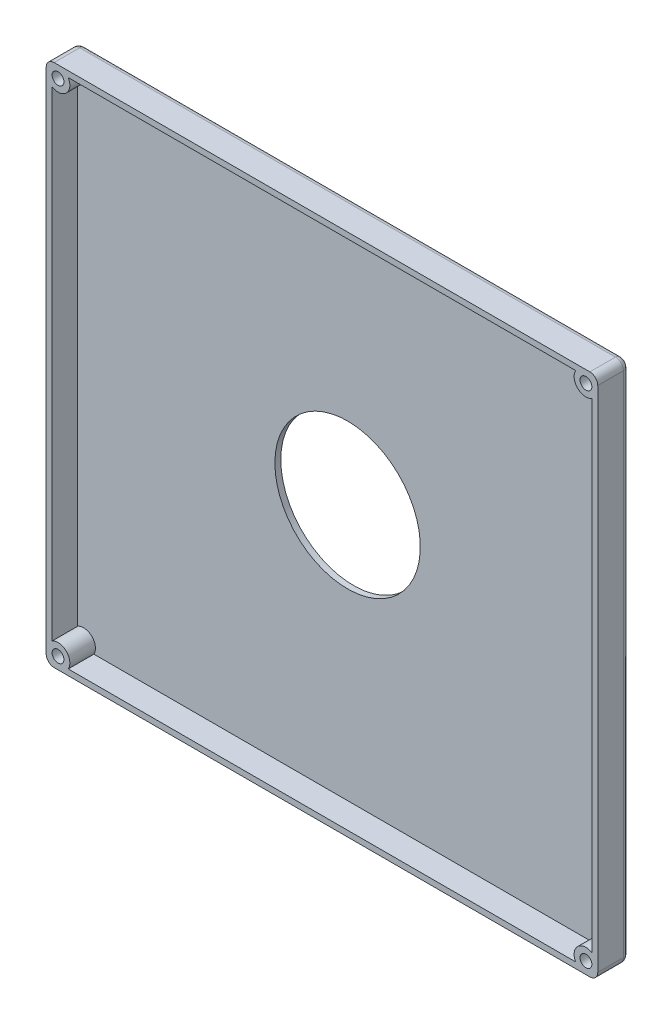
ISO-10303-21;
HEADER;
FILE_DESCRIPTION(('STEP AP214'),'2;1');
FILE_NAME('part.step','',(''),(''),'','','');
FILE_SCHEMA(('AUTOMOTIVE_DESIGN { 1 0 10303 214 1 1 1 1 }'));
ENDSEC;
DATA;
#1=APPLICATION_CONTEXT('core data for automotive mechanical design processes');
#2=APPLICATION_PROTOCOL_DEFINITION('international standard','automotive_design',2000,#1);
#3=PRODUCT_CONTEXT('',#1,'mechanical');
#4=PRODUCT('Part','Part','',(#3));
#5=PRODUCT_RELATED_PRODUCT_CATEGORY('part','',(#4));
#6=PRODUCT_DEFINITION_FORMATION('','',#4);
#7=PRODUCT_DEFINITION_CONTEXT('part definition',#1,'design');
#8=PRODUCT_DEFINITION('design','',#6,#7);
#9=PRODUCT_DEFINITION_SHAPE('','',#8);
#10=(LENGTH_UNIT() NAMED_UNIT(*) SI_UNIT(.MILLI.,.METRE.));
#11=(NAMED_UNIT(*) PLANE_ANGLE_UNIT() SI_UNIT($,.RADIAN.));
#12=(NAMED_UNIT(*) SI_UNIT($,.STERADIAN.) SOLID_ANGLE_UNIT());
#13=UNCERTAINTY_MEASURE_WITH_UNIT(LENGTH_MEASURE(1.E-05),#10,'distance_accuracy_value','');
#14=(GEOMETRIC_REPRESENTATION_CONTEXT(3) GLOBAL_UNCERTAINTY_ASSIGNED_CONTEXT((#13)) GLOBAL_UNIT_ASSIGNED_CONTEXT((#10,
#11,#12)) REPRESENTATION_CONTEXT('',''));
#15=CARTESIAN_POINT('',(0.,0.,0.));
#16=DIRECTION('',(0.,0.,1.));
#17=DIRECTION('',(1.,0.,0.));
#18=AXIS2_PLACEMENT_3D('',#15,#16,#17);
#19=CARTESIAN_POINT('',(68.5,-66.5,1.5));
#20=DIRECTION('',(0.,-1.,0.));
#21=DIRECTION('',(0.,0.,-1.));
#22=AXIS2_PLACEMENT_3D('',#19,#20,#21);
#23=CYLINDRICAL_SURFACE('',#22,1.5);
#24=CARTESIAN_POINT('',(68.5,64.5,1.5));
#25=DIRECTION('',(0.,1.,0.));
#26=DIRECTION('',(0.,0.,1.));
#27=AXIS2_PLACEMENT_3D('',#24,#25,#26);
#28=CIRCLE('',#27,1.5);
#29=CARTESIAN_POINT('',(70.,64.5,1.5));
#30=VERTEX_POINT('',#29);
#31=CARTESIAN_POINT('',(68.5,64.5,0.));
#32=VERTEX_POINT('',#31);
#33=EDGE_CURVE('E11',#30,#32,#28,.T.);
#34=ORIENTED_EDGE('',*,*,#33,.F.);
#35=DIRECTION('',(0.,1.,0.));
#36=VECTOR('',#35,1.);
#37=CARTESIAN_POINT('',(70.,-66.5,1.5));
#38=LINE('',#37,#36);
#39=CARTESIAN_POINT('',(70.,-64.5,1.5));
#40=VERTEX_POINT('',#39);
#41=EDGE_CURVE('E403',#40,#30,#38,.T.);
#42=ORIENTED_EDGE('',*,*,#41,.F.);
#43=CARTESIAN_POINT('',(68.5,-64.5,1.5));
#44=DIRECTION('',(0.,1.,0.));
#45=DIRECTION('',(0.,0.,1.));
#46=AXIS2_PLACEMENT_3D('',#43,#44,#45);
#47=CIRCLE('',#46,1.5);
#48=CARTESIAN_POINT('',(68.5,-64.5,0.));
#49=VERTEX_POINT('',#48);
#50=EDGE_CURVE('E45',#40,#49,#47,.T.);
#51=ORIENTED_EDGE('',*,*,#50,.T.);
#52=DIRECTION('',(0.,1.,0.));
#53=VECTOR('',#52,1.);
#54=CARTESIAN_POINT('',(68.5,-66.5,0.));
#55=LINE('',#54,#53);
#56=CARTESIAN_POINT('',(68.5,-63.5,0.));
#57=VERTEX_POINT('',#56);
#58=EDGE_CURVE('E342',#57,#49,#55,.F.);
#59=ORIENTED_EDGE('',*,*,#58,.F.);
#60=DIRECTION('',(0.,1.,0.));
#61=VECTOR('',#60,1.);
#62=CARTESIAN_POINT('',(68.5,-66.5,0.));
#63=LINE('',#62,#61);
#64=CARTESIAN_POINT('',(68.5,63.5,0.));
#65=VERTEX_POINT('',#64);
#66=EDGE_CURVE('E345',#65,#57,#63,.F.);
#67=ORIENTED_EDGE('',*,*,#66,.F.);
#68=DIRECTION('',(0.,1.,0.));
#69=VECTOR('',#68,1.);
#70=CARTESIAN_POINT('',(68.5,-66.5,0.));
#71=LINE('',#70,#69);
#72=EDGE_CURVE('E347',#32,#65,#71,.F.);
#73=ORIENTED_EDGE('',*,*,#72,.F.);
#74=EDGE_LOOP('',(#34,#42,#51,#59,#67,#73));
#75=FACE_BOUND('',#74,.T.);
#76=ADVANCED_FACE('F38',(#75),#23,.T.);
#77=CARTESIAN_POINT('',(68.,-64.5,1.5));
#78=DIRECTION('',(0.,0.,-1.));
#79=DIRECTION('',(-1.,0.,0.));
#80=AXIS2_PLACEMENT_3D('',#77,#78,#79);
#81=DEGENERATE_TOROIDAL_SURFACE('',#80,0.5,1.5,.T.);
#82=ORIENTED_EDGE('',*,*,#50,.F.);
#83=CARTESIAN_POINT('',(68.,-64.5,1.5));
#84=DIRECTION('',(0.,0.,-1.));
#85=DIRECTION('',(-1.,0.,0.));
#86=AXIS2_PLACEMENT_3D('',#83,#84,#85);
#87=CIRCLE('',#86,2.);
#88=CARTESIAN_POINT('',(68.,-66.5,1.5));
#89=VERTEX_POINT('',#88);
#90=EDGE_CURVE('E400',#89,#40,#87,.F.);
#91=ORIENTED_EDGE('',*,*,#90,.F.);
#92=CARTESIAN_POINT('',(68.,-65.,1.5));
#93=DIRECTION('',(1.,0.,0.));
#94=DIRECTION('',(0.,0.,-1.));
#95=AXIS2_PLACEMENT_3D('',#92,#93,#94);
#96=CIRCLE('',#95,1.5);
#97=CARTESIAN_POINT('',(68.,-65.,0.));
#98=VERTEX_POINT('',#97);
#99=EDGE_CURVE('E59',#89,#98,#96,.T.);
#100=ORIENTED_EDGE('',*,*,#99,.T.);
#101=CARTESIAN_POINT('',(68.,-64.5,0.));
#102=DIRECTION('',(0.,0.,-1.));
#103=DIRECTION('',(-1.,0.,0.));
#104=AXIS2_PLACEMENT_3D('',#101,#102,#103);
#105=CIRCLE('',#104,0.5);
#106=EDGE_CURVE('E349',#49,#98,#105,.T.);
#107=ORIENTED_EDGE('',*,*,#106,.F.);
#108=EDGE_LOOP('',(#82,#91,#100,#107));
#109=FACE_BOUND('',#108,.T.);
#110=ADVANCED_FACE('F420',(#109),#81,.T.);
#111=CARTESIAN_POINT('',(-70.,-65.,1.5));
#112=DIRECTION('',(-1.,0.,0.));
#113=DIRECTION('',(0.,0.,1.));
#114=AXIS2_PLACEMENT_3D('',#111,#112,#113);
#115=CYLINDRICAL_SURFACE('',#114,1.5);
#116=ORIENTED_EDGE('',*,*,#99,.F.);
#117=DIRECTION('',(1.,0.,0.));
#118=VECTOR('',#117,1.);
#119=CARTESIAN_POINT('',(-70.,-66.5,1.5));
#120=LINE('',#119,#118);
#121=CARTESIAN_POINT('',(-68.,-66.5,1.5));
#122=VERTEX_POINT('',#121);
#123=EDGE_CURVE('E397',#122,#89,#120,.T.);
#124=ORIENTED_EDGE('',*,*,#123,.F.);
#125=CARTESIAN_POINT('',(-68.,-65.,1.5));
#126=DIRECTION('',(1.,0.,0.));
#127=DIRECTION('',(0.,0.,-1.));
#128=AXIS2_PLACEMENT_3D('',#125,#126,#127);
#129=CIRCLE('',#128,1.5);
#130=CARTESIAN_POINT('',(-68.,-65.,0.));
#131=VERTEX_POINT('',#130);
#132=EDGE_CURVE('E414',#122,#131,#129,.T.);
#133=ORIENTED_EDGE('',*,*,#132,.T.);
#134=DIRECTION('',(1.,0.,0.));
#135=VECTOR('',#134,1.);
#136=CARTESIAN_POINT('',(-70.,-65.,0.));
#137=LINE('',#136,#135);
#138=CARTESIAN_POINT('',(-67.,-65.,0.));
#139=VERTEX_POINT('',#138);
#140=EDGE_CURVE('E368',#139,#131,#137,.F.);
#141=ORIENTED_EDGE('',*,*,#140,.F.);
#142=DIRECTION('',(1.,0.,0.));
#143=VECTOR('',#142,1.);
#144=CARTESIAN_POINT('',(-70.,-65.,0.));
#145=LINE('',#144,#143);
#146=CARTESIAN_POINT('',(67.,-65.,0.));
#147=VERTEX_POINT('',#146);
#148=EDGE_CURVE('E358',#147,#139,#145,.F.);
#149=ORIENTED_EDGE('',*,*,#148,.F.);
#150=DIRECTION('',(1.,0.,0.));
#151=VECTOR('',#150,1.);
#152=CARTESIAN_POINT('',(-70.,-65.,0.));
#153=LINE('',#152,#151);
#154=EDGE_CURVE('E352',#98,#147,#153,.F.);
#155=ORIENTED_EDGE('',*,*,#154,.F.);
#156=EDGE_LOOP('',(#116,#124,#133,#141,#149,#155));
#157=FACE_BOUND('',#156,.T.);
#158=ADVANCED_FACE('F461',(#157),#115,.T.);
#159=CARTESIAN_POINT('',(-68.,-64.5,1.5));
#160=DIRECTION('',(0.,0.,-1.));
#161=DIRECTION('',(-1.,0.,0.));
#162=AXIS2_PLACEMENT_3D('',#159,#160,#161);
#163=DEGENERATE_TOROIDAL_SURFACE('',#162,0.5,1.5,.T.);
#164=ORIENTED_EDGE('',*,*,#132,.F.);
#165=CARTESIAN_POINT('',(-68.,-64.5,1.5));
#166=DIRECTION('',(0.,0.,-1.));
#167=DIRECTION('',(-1.,0.,0.));
#168=AXIS2_PLACEMENT_3D('',#165,#166,#167);
#169=CIRCLE('',#168,2.);
#170=CARTESIAN_POINT('',(-70.,-64.5,1.5));
#171=VERTEX_POINT('',#170);
#172=EDGE_CURVE('E394',#171,#122,#169,.F.);
#173=ORIENTED_EDGE('',*,*,#172,.F.);
#174=CARTESIAN_POINT('',(-68.5,-64.5,1.5));
#175=DIRECTION('',(0.,-1.,0.));
#176=DIRECTION('',(0.,0.,-1.));
#177=AXIS2_PLACEMENT_3D('',#174,#175,#176);
#178=CIRCLE('',#177,1.5);
#179=CARTESIAN_POINT('',(-68.5,-64.5,0.));
#180=VERTEX_POINT('',#179);
#181=EDGE_CURVE('E412',#171,#180,#178,.T.);
#182=ORIENTED_EDGE('',*,*,#181,.T.);
#183=CARTESIAN_POINT('',(-68.,-64.5,0.));
#184=DIRECTION('',(0.,0.,-1.));
#185=DIRECTION('',(-1.,0.,0.));
#186=AXIS2_PLACEMENT_3D('',#183,#184,#185);
#187=CIRCLE('',#186,0.5);
#188=EDGE_CURVE('E371',#131,#180,#187,.T.);
#189=ORIENTED_EDGE('',*,*,#188,.F.);
#190=EDGE_LOOP('',(#164,#173,#182,#189));
#191=FACE_BOUND('',#190,.T.);
#192=ADVANCED_FACE('F469',(#191),#163,.T.);
#193=CARTESIAN_POINT('',(-68.5,-66.5,1.5));
#194=DIRECTION('',(0.,1.,0.));
#195=DIRECTION('',(0.,0.,1.));
#196=AXIS2_PLACEMENT_3D('',#193,#194,#195);
#197=CYLINDRICAL_SURFACE('',#196,1.5);
#198=ORIENTED_EDGE('',*,*,#181,.F.);
#199=DIRECTION('',(0.,-1.,0.));
#200=VECTOR('',#199,1.);
#201=CARTESIAN_POINT('',(-70.,-66.5,1.5));
#202=LINE('',#201,#200);
#203=CARTESIAN_POINT('',(-70.,64.5,1.5));
#204=VERTEX_POINT('',#203);
#205=EDGE_CURVE('E391',#204,#171,#202,.T.);
#206=ORIENTED_EDGE('',*,*,#205,.F.);
#207=CARTESIAN_POINT('',(-68.5,64.5,1.5));
#208=DIRECTION('',(0.,-1.,0.));
#209=DIRECTION('',(0.,0.,-1.));
#210=AXIS2_PLACEMENT_3D('',#207,#208,#209);
#211=CIRCLE('',#210,1.5);
#212=CARTESIAN_POINT('',(-68.5,64.5,0.));
#213=VERTEX_POINT('',#212);
#214=EDGE_CURVE('E410',#204,#213,#211,.T.);
#215=ORIENTED_EDGE('',*,*,#214,.T.);
#216=DIRECTION('',(0.,-1.,0.));
#217=VECTOR('',#216,1.);
#218=CARTESIAN_POINT('',(-68.5,-66.5,0.));
#219=LINE('',#218,#217);
#220=CARTESIAN_POINT('',(-68.5,63.5,0.));
#221=VERTEX_POINT('',#220);
#222=EDGE_CURVE('E380',#221,#213,#219,.F.);
#223=ORIENTED_EDGE('',*,*,#222,.F.);
#224=DIRECTION('',(0.,-1.,0.));
#225=VECTOR('',#224,1.);
#226=CARTESIAN_POINT('',(-68.5,-66.5,0.));
#227=LINE('',#226,#225);
#228=CARTESIAN_POINT('',(-68.5,-63.5,0.));
#229=VERTEX_POINT('',#228);
#230=EDGE_CURVE('E383',#229,#221,#227,.F.);
#231=ORIENTED_EDGE('',*,*,#230,.F.);
#232=DIRECTION('',(0.,-1.,0.));
#233=VECTOR('',#232,1.);
#234=CARTESIAN_POINT('',(-68.5,-66.5,0.));
#235=LINE('',#234,#233);
#236=EDGE_CURVE('E374',#180,#229,#235,.F.);
#237=ORIENTED_EDGE('',*,*,#236,.F.);
#238=EDGE_LOOP('',(#198,#206,#215,#223,#231,#237));
#239=FACE_BOUND('',#238,.T.);
#240=ADVANCED_FACE('F477',(#239),#197,.T.);
#241=CARTESIAN_POINT('',(-68.,64.5,1.5));
#242=DIRECTION('',(0.,0.,-1.));
#243=DIRECTION('',(-1.,0.,0.));
#244=AXIS2_PLACEMENT_3D('',#241,#242,#243);
#245=DEGENERATE_TOROIDAL_SURFACE('',#244,0.5,1.5,.T.);
#246=ORIENTED_EDGE('',*,*,#214,.F.);
#247=CARTESIAN_POINT('',(-68.,64.5,1.5));
#248=DIRECTION('',(0.,0.,-1.));
#249=DIRECTION('',(-1.,0.,0.));
#250=AXIS2_PLACEMENT_3D('',#247,#248,#249);
#251=CIRCLE('',#250,2.);
#252=CARTESIAN_POINT('',(-68.,66.5,1.5));
#253=VERTEX_POINT('',#252);
#254=EDGE_CURVE('E388',#253,#204,#251,.F.);
#255=ORIENTED_EDGE('',*,*,#254,.F.);
#256=CARTESIAN_POINT('',(-68.,65.,1.5));
#257=DIRECTION('',(-1.,0.,0.));
#258=DIRECTION('',(0.,0.,1.));
#259=AXIS2_PLACEMENT_3D('',#256,#257,#258);
#260=CIRCLE('',#259,1.5);
#261=CARTESIAN_POINT('',(-68.,65.,0.));
#262=VERTEX_POINT('',#261);
#263=EDGE_CURVE('E408',#253,#262,#260,.T.);
#264=ORIENTED_EDGE('',*,*,#263,.T.);
#265=CARTESIAN_POINT('',(-68.,64.5,0.));
#266=DIRECTION('',(0.,0.,-1.));
#267=DIRECTION('',(-1.,0.,0.));
#268=AXIS2_PLACEMENT_3D('',#265,#266,#267);
#269=CIRCLE('',#268,0.5);
#270=EDGE_CURVE('E377',#213,#262,#269,.T.);
#271=ORIENTED_EDGE('',*,*,#270,.F.);
#272=EDGE_LOOP('',(#246,#255,#264,#271));
#273=FACE_BOUND('',#272,.T.);
#274=ADVANCED_FACE('F485',(#273),#245,.T.);
#275=CARTESIAN_POINT('',(-70.,65.,1.5));
#276=DIRECTION('',(1.,0.,0.));
#277=DIRECTION('',(0.,0.,-1.));
#278=AXIS2_PLACEMENT_3D('',#275,#276,#277);
#279=CYLINDRICAL_SURFACE('',#278,1.5);
#280=ORIENTED_EDGE('',*,*,#263,.F.);
#281=DIRECTION('',(-1.,0.,0.));
#282=VECTOR('',#281,1.);
#283=CARTESIAN_POINT('',(-70.,66.5,1.5));
#284=LINE('',#283,#282);
#285=CARTESIAN_POINT('',(68.,66.5,1.5));
#286=VERTEX_POINT('',#285);
#287=EDGE_CURVE('E385',#286,#253,#284,.T.);
#288=ORIENTED_EDGE('',*,*,#287,.F.);
#289=CARTESIAN_POINT('',(68.,65.,1.5));
#290=DIRECTION('',(-1.,0.,0.));
#291=DIRECTION('',(0.,0.,1.));
#292=AXIS2_PLACEMENT_3D('',#289,#290,#291);
#293=CIRCLE('',#292,1.5);
#294=CARTESIAN_POINT('',(68.,65.,0.));
#295=VERTEX_POINT('',#294);
#296=EDGE_CURVE('E406',#286,#295,#293,.T.);
#297=ORIENTED_EDGE('',*,*,#296,.T.);
#298=DIRECTION('',(-1.,0.,0.));
#299=VECTOR('',#298,1.);
#300=CARTESIAN_POINT('',(-70.,65.,0.));
#301=LINE('',#300,#299);
#302=CARTESIAN_POINT('',(67.,65.,0.));
#303=VERTEX_POINT('',#302);
#304=EDGE_CURVE('E361',#303,#295,#301,.F.);
#305=ORIENTED_EDGE('',*,*,#304,.F.);
#306=DIRECTION('',(-1.,0.,0.));
#307=VECTOR('',#306,1.);
#308=CARTESIAN_POINT('',(-70.,65.,0.));
#309=LINE('',#308,#307);
#310=CARTESIAN_POINT('',(-67.,65.,0.));
#311=VERTEX_POINT('',#310);
#312=EDGE_CURVE('E364',#311,#303,#309,.F.);
#313=ORIENTED_EDGE('',*,*,#312,.F.);
#314=DIRECTION('',(-1.,0.,0.));
#315=VECTOR('',#314,1.);
#316=CARTESIAN_POINT('',(-70.,65.,0.));
#317=LINE('',#316,#315);
#318=EDGE_CURVE('E366',#262,#311,#317,.F.);
#319=ORIENTED_EDGE('',*,*,#318,.F.);
#320=EDGE_LOOP('',(#280,#288,#297,#305,#313,#319));
#321=FACE_BOUND('',#320,.T.);
#322=ADVANCED_FACE('F491',(#321),#279,.T.);
#323=CARTESIAN_POINT('',(68.,64.5,1.5));
#324=DIRECTION('',(0.,0.,-1.));
#325=DIRECTION('',(-1.,0.,0.));
#326=AXIS2_PLACEMENT_3D('',#323,#324,#325);
#327=DEGENERATE_TOROIDAL_SURFACE('',#326,0.5,1.5,.T.);
#328=CARTESIAN_POINT('',(68.,64.5,1.5));
#329=DIRECTION('',(0.,0.,-1.));
#330=DIRECTION('',(-1.,0.,0.));
#331=AXIS2_PLACEMENT_3D('',#328,#329,#330);
#332=CIRCLE('',#331,2.);
#333=EDGE_CURVE('E336',#30,#286,#332,.F.);
#334=ORIENTED_EDGE('',*,*,#333,.F.);
#335=ORIENTED_EDGE('',*,*,#33,.T.);
#336=CARTESIAN_POINT('',(68.,64.5,0.));
#337=DIRECTION('',(0.,0.,-1.));
#338=DIRECTION('',(-1.,0.,0.));
#339=AXIS2_PLACEMENT_3D('',#336,#337,#338);
#340=CIRCLE('',#339,0.5);
#341=EDGE_CURVE('E355',#295,#32,#340,.T.);
#342=ORIENTED_EDGE('',*,*,#341,.F.);
#343=ORIENTED_EDGE('',*,*,#296,.F.);
#344=EDGE_LOOP('',(#334,#335,#342,#343));
#345=FACE_BOUND('',#344,.T.);
#346=ADVANCED_FACE('F442',(#345),#327,.T.);
#347=CARTESIAN_POINT('',(0.,0.,0.));
#348=DIRECTION('',(0.,0.,-1.));
#349=DIRECTION('',(-1.,0.,0.));
#350=AXIS2_PLACEMENT_3D('',#347,#348,#349);
#351=PLANE('',#350);
#352=CARTESIAN_POINT('',(0.,0.,0.));
#353=DIRECTION('',(0.,0.,-1.));
#354=DIRECTION('',(-1.,0.,0.));
#355=AXIS2_PLACEMENT_3D('',#352,#353,#354);
#356=CIRCLE('',#355,18.4549103319447);
#357=CARTESIAN_POINT('',(-18.4549103319447,0.,0.));
#358=VERTEX_POINT('',#357);
#359=EDGE_CURVE('E339',#358,#358,#356,.T.);
#360=ORIENTED_EDGE('',*,*,#359,.F.);
#361=EDGE_LOOP('',(#360));
#362=FACE_BOUND('',#361,.T.);
#363=CARTESIAN_POINT('',(-67.,-63.5,0.));
#364=DIRECTION('',(0.,0.,1.));
#365=DIRECTION('',(1.,0.,0.));
#366=AXIS2_PLACEMENT_3D('',#363,#364,#365);
#367=CIRCLE('',#366,1.5);
#368=EDGE_CURVE('E285',#139,#229,#367,.T.);
#369=ORIENTED_EDGE('',*,*,#368,.T.);
#370=ORIENTED_EDGE('',*,*,#230,.T.);
#371=CARTESIAN_POINT('',(-67.,63.5,0.));
#372=DIRECTION('',(0.,0.,1.));
#373=DIRECTION('',(1.,0.,0.));
#374=AXIS2_PLACEMENT_3D('',#371,#372,#373);
#375=CIRCLE('',#374,1.5);
#376=EDGE_CURVE('E271',#221,#311,#375,.T.);
#377=ORIENTED_EDGE('',*,*,#376,.T.);
#378=ORIENTED_EDGE('',*,*,#312,.T.);
#379=CARTESIAN_POINT('',(67.,63.5,0.));
#380=DIRECTION('',(0.,0.,1.));
#381=DIRECTION('',(1.,0.,0.));
#382=AXIS2_PLACEMENT_3D('',#379,#380,#381);
#383=CIRCLE('',#382,1.5);
#384=EDGE_CURVE('E278',#303,#65,#383,.T.);
#385=ORIENTED_EDGE('',*,*,#384,.T.);
#386=ORIENTED_EDGE('',*,*,#66,.T.);
#387=CARTESIAN_POINT('',(67.,-63.5,0.));
#388=DIRECTION('',(0.,0.,1.));
#389=DIRECTION('',(1.,0.,0.));
#390=AXIS2_PLACEMENT_3D('',#387,#388,#389);
#391=CIRCLE('',#390,1.5);
#392=EDGE_CURVE('E293',#57,#147,#391,.T.);
#393=ORIENTED_EDGE('',*,*,#392,.T.);
#394=ORIENTED_EDGE('',*,*,#148,.T.);
#395=EDGE_LOOP('',(#369,#370,#377,#378,#385,#386,#393,#394));
#396=FACE_BOUND('',#395,.T.);
#397=ADVANCED_FACE('F430',(#362,#396),#351,.T.);
#398=EDGE_CURVE('E272',#311,#221,#375,.T.);
#399=ORIENTED_EDGE('',*,*,#398,.T.);
#400=ORIENTED_EDGE('',*,*,#222,.T.);
#401=ORIENTED_EDGE('',*,*,#270,.T.);
#402=ORIENTED_EDGE('',*,*,#318,.T.);
#403=EDGE_LOOP('',(#399,#400,#401,#402));
#404=FACE_BOUND('',#403,.T.);
#405=ADVANCED_FACE('F496',(#404),#351,.T.);
#406=ORIENTED_EDGE('',*,*,#188,.T.);
#407=ORIENTED_EDGE('',*,*,#236,.T.);
#408=EDGE_CURVE('E286',#229,#139,#367,.T.);
#409=ORIENTED_EDGE('',*,*,#408,.T.);
#410=ORIENTED_EDGE('',*,*,#140,.T.);
#411=EDGE_LOOP('',(#406,#407,#409,#410));
#412=FACE_BOUND('',#411,.T.);
#413=ADVANCED_FACE('F507',(#412),#351,.T.);
#414=EDGE_CURVE('E279',#65,#303,#383,.T.);
#415=ORIENTED_EDGE('',*,*,#414,.T.);
#416=ORIENTED_EDGE('',*,*,#304,.T.);
#417=ORIENTED_EDGE('',*,*,#341,.T.);
#418=ORIENTED_EDGE('',*,*,#72,.T.);
#419=EDGE_LOOP('',(#415,#416,#417,#418));
#420=FACE_BOUND('',#419,.T.);
#421=ADVANCED_FACE('F437',(#420),#351,.T.);
#422=CARTESIAN_POINT('',(68.,64.5,8.));
#423=DIRECTION('',(0.,0.,1.));
#424=DIRECTION('',(1.,0.,0.));
#425=AXIS2_PLACEMENT_3D('',#422,#423,#424);
#426=CYLINDRICAL_SURFACE('',#425,2.);
#427=DIRECTION('',(0.,0.,1.));
#428=VECTOR('',#427,1.);
#429=CARTESIAN_POINT('',(70.,64.5,8.));
#430=LINE('',#429,#428);
#431=CARTESIAN_POINT('',(70.,64.5,8.));
#432=VERTEX_POINT('',#431);
#433=EDGE_CURVE('E329',#30,#432,#430,.T.);
#434=ORIENTED_EDGE('',*,*,#433,.F.);
#435=ORIENTED_EDGE('',*,*,#333,.T.);
#436=DIRECTION('',(0.,0.,1.));
#437=VECTOR('',#436,1.);
#438=CARTESIAN_POINT('',(68.,66.5,8.));
#439=LINE('',#438,#437);
#440=CARTESIAN_POINT('',(68.,66.5,8.));
#441=VERTEX_POINT('',#440);
#442=EDGE_CURVE('E331',#441,#286,#439,.F.);
#443=ORIENTED_EDGE('',*,*,#442,.F.);
#444=CARTESIAN_POINT('',(68.,64.5,8.));
#445=DIRECTION('',(0.,0.,-1.));
#446=DIRECTION('',(-1.,0.,0.));
#447=AXIS2_PLACEMENT_3D('',#444,#445,#446);
#448=CIRCLE('',#447,2.);
#449=EDGE_CURVE('E334',#432,#441,#448,.F.);
#450=ORIENTED_EDGE('',*,*,#449,.F.);
#451=EDGE_LOOP('',(#434,#435,#443,#450));
#452=FACE_BOUND('',#451,.T.);
#453=ADVANCED_FACE('F448',(#452),#426,.T.);
#454=CARTESIAN_POINT('',(68.,-64.5,8.));
#455=DIRECTION('',(0.,0.,1.));
#456=DIRECTION('',(1.,0.,0.));
#457=AXIS2_PLACEMENT_3D('',#454,#455,#456);
#458=CYLINDRICAL_SURFACE('',#457,2.);
#459=DIRECTION('',(0.,0.,1.));
#460=VECTOR('',#459,1.);
#461=CARTESIAN_POINT('',(68.,-66.5,8.));
#462=LINE('',#461,#460);
#463=CARTESIAN_POINT('',(68.,-66.5,8.));
#464=VERTEX_POINT('',#463);
#465=EDGE_CURVE('E322',#89,#464,#462,.T.);
#466=ORIENTED_EDGE('',*,*,#465,.F.);
#467=ORIENTED_EDGE('',*,*,#90,.T.);
#468=DIRECTION('',(0.,0.,1.));
#469=VECTOR('',#468,1.);
#470=CARTESIAN_POINT('',(70.,-64.5,8.));
#471=LINE('',#470,#469);
#472=CARTESIAN_POINT('',(70.,-64.5,8.));
#473=VERTEX_POINT('',#472);
#474=EDGE_CURVE('E324',#473,#40,#471,.F.);
#475=ORIENTED_EDGE('',*,*,#474,.F.);
#476=CARTESIAN_POINT('',(68.,-64.5,8.));
#477=DIRECTION('',(0.,0.,-1.));
#478=DIRECTION('',(-1.,0.,0.));
#479=AXIS2_PLACEMENT_3D('',#476,#477,#478);
#480=CIRCLE('',#479,2.);
#481=EDGE_CURVE('E327',#464,#473,#480,.F.);
#482=ORIENTED_EDGE('',*,*,#481,.F.);
#483=EDGE_LOOP('',(#466,#467,#475,#482));
#484=FACE_BOUND('',#483,.T.);
#485=ADVANCED_FACE('F456',(#484),#458,.T.);
#486=CARTESIAN_POINT('',(-68.,-64.5,8.));
#487=DIRECTION('',(0.,0.,1.));
#488=DIRECTION('',(1.,0.,0.));
#489=AXIS2_PLACEMENT_3D('',#486,#487,#488);
#490=CYLINDRICAL_SURFACE('',#489,2.);
#491=DIRECTION('',(0.,0.,1.));
#492=VECTOR('',#491,1.);
#493=CARTESIAN_POINT('',(-70.,-64.5,8.));
#494=LINE('',#493,#492);
#495=CARTESIAN_POINT('',(-70.,-64.5,8.));
#496=VERTEX_POINT('',#495);
#497=EDGE_CURVE('E315',#171,#496,#494,.T.);
#498=ORIENTED_EDGE('',*,*,#497,.F.);
#499=ORIENTED_EDGE('',*,*,#172,.T.);
#500=DIRECTION('',(0.,0.,1.));
#501=VECTOR('',#500,1.);
#502=CARTESIAN_POINT('',(-68.,-66.5,8.));
#503=LINE('',#502,#501);
#504=CARTESIAN_POINT('',(-68.,-66.5,8.));
#505=VERTEX_POINT('',#504);
#506=EDGE_CURVE('E317',#505,#122,#503,.F.);
#507=ORIENTED_EDGE('',*,*,#506,.F.);
#508=CARTESIAN_POINT('',(-68.,-64.5,8.));
#509=DIRECTION('',(0.,0.,-1.));
#510=DIRECTION('',(-1.,0.,0.));
#511=AXIS2_PLACEMENT_3D('',#508,#509,#510);
#512=CIRCLE('',#511,2.);
#513=EDGE_CURVE('E320',#496,#505,#512,.F.);
#514=ORIENTED_EDGE('',*,*,#513,.F.);
#515=EDGE_LOOP('',(#498,#499,#507,#514));
#516=FACE_BOUND('',#515,.T.);
#517=ADVANCED_FACE('F466',(#516),#490,.T.);
#518=CARTESIAN_POINT('',(-68.,64.5,8.));
#519=DIRECTION('',(0.,0.,1.));
#520=DIRECTION('',(1.,0.,0.));
#521=AXIS2_PLACEMENT_3D('',#518,#519,#520);
#522=CYLINDRICAL_SURFACE('',#521,2.);
#523=DIRECTION('',(0.,0.,1.));
#524=VECTOR('',#523,1.);
#525=CARTESIAN_POINT('',(-68.,66.5,8.));
#526=LINE('',#525,#524);
#527=CARTESIAN_POINT('',(-68.,66.5,8.));
#528=VERTEX_POINT('',#527);
#529=EDGE_CURVE('E308',#253,#528,#526,.T.);
#530=ORIENTED_EDGE('',*,*,#529,.F.);
#531=ORIENTED_EDGE('',*,*,#254,.T.);
#532=DIRECTION('',(0.,0.,1.));
#533=VECTOR('',#532,1.);
#534=CARTESIAN_POINT('',(-70.,64.5,8.));
#535=LINE('',#534,#533);
#536=CARTESIAN_POINT('',(-70.,64.5,8.));
#537=VERTEX_POINT('',#536);
#538=EDGE_CURVE('E310',#537,#204,#535,.F.);
#539=ORIENTED_EDGE('',*,*,#538,.F.);
#540=CARTESIAN_POINT('',(-68.,64.5,8.));
#541=DIRECTION('',(0.,0.,-1.));
#542=DIRECTION('',(-1.,0.,0.));
#543=AXIS2_PLACEMENT_3D('',#540,#541,#542);
#544=CIRCLE('',#543,2.);
#545=EDGE_CURVE('E313',#528,#537,#544,.F.);
#546=ORIENTED_EDGE('',*,*,#545,.F.);
#547=EDGE_LOOP('',(#530,#531,#539,#546));
#548=FACE_BOUND('',#547,.T.);
#549=ADVANCED_FACE('F482',(#548),#522,.T.);
#550=ORIENTED_EDGE('',*,*,#106,.T.);
#551=ORIENTED_EDGE('',*,*,#154,.T.);
#552=EDGE_CURVE('E292',#147,#57,#391,.T.);
#553=ORIENTED_EDGE('',*,*,#552,.T.);
#554=ORIENTED_EDGE('',*,*,#58,.T.);
#555=EDGE_LOOP('',(#550,#551,#553,#554));
#556=FACE_BOUND('',#555,.T.);
#557=ADVANCED_FACE('F422',(#556),#351,.T.);
#558=CARTESIAN_POINT('',(70.,-66.5,8.));
#559=DIRECTION('',(-1.,0.,0.));
#560=DIRECTION('',(0.,0.,1.));
#561=AXIS2_PLACEMENT_3D('',#558,#559,#560);
#562=PLANE('',#561);
#563=ORIENTED_EDGE('',*,*,#474,.T.);
#564=ORIENTED_EDGE('',*,*,#41,.T.);
#565=ORIENTED_EDGE('',*,*,#433,.T.);
#566=DIRECTION('',(0.,1.,0.));
#567=VECTOR('',#566,1.);
#568=CARTESIAN_POINT('',(70.,-66.5,8.));
#569=LINE('',#568,#567);
#570=EDGE_CURVE('E296',#473,#432,#569,.T.);
#571=ORIENTED_EDGE('',*,*,#570,.F.);
#572=EDGE_LOOP('',(#563,#564,#565,#571));
#573=FACE_BOUND('',#572,.T.);
#574=ADVANCED_FACE('F451',(#573),#562,.F.);
#575=CARTESIAN_POINT('',(-70.,66.5,8.));
#576=DIRECTION('',(0.,-1.,0.));
#577=DIRECTION('',(0.,0.,-1.));
#578=AXIS2_PLACEMENT_3D('',#575,#576,#577);
#579=PLANE('',#578);
#580=ORIENTED_EDGE('',*,*,#442,.T.);
#581=ORIENTED_EDGE('',*,*,#287,.T.);
#582=ORIENTED_EDGE('',*,*,#529,.T.);
#583=DIRECTION('',(-1.,0.,0.));
#584=VECTOR('',#583,1.);
#585=CARTESIAN_POINT('',(-70.,66.5,8.));
#586=LINE('',#585,#584);
#587=EDGE_CURVE('E299',#441,#528,#586,.T.);
#588=ORIENTED_EDGE('',*,*,#587,.F.);
#589=EDGE_LOOP('',(#580,#581,#582,#588));
#590=FACE_BOUND('',#589,.T.);
#591=ADVANCED_FACE('F488',(#590),#579,.F.);
#592=CARTESIAN_POINT('',(-70.,-66.5,8.));
#593=DIRECTION('',(1.,0.,0.));
#594=DIRECTION('',(0.,0.,-1.));
#595=AXIS2_PLACEMENT_3D('',#592,#593,#594);
#596=PLANE('',#595);
#597=ORIENTED_EDGE('',*,*,#538,.T.);
#598=ORIENTED_EDGE('',*,*,#205,.T.);
#599=ORIENTED_EDGE('',*,*,#497,.T.);
#600=DIRECTION('',(0.,-1.,0.));
#601=VECTOR('',#600,1.);
#602=CARTESIAN_POINT('',(-70.,-66.5,8.));
#603=LINE('',#602,#601);
#604=EDGE_CURVE('E302',#537,#496,#603,.T.);
#605=ORIENTED_EDGE('',*,*,#604,.F.);
#606=EDGE_LOOP('',(#597,#598,#599,#605));
#607=FACE_BOUND('',#606,.T.);
#608=ADVANCED_FACE('F473',(#607),#596,.F.);
#609=CARTESIAN_POINT('',(-70.,-66.5,8.));
#610=DIRECTION('',(0.,1.,0.));
#611=DIRECTION('',(0.,0.,1.));
#612=AXIS2_PLACEMENT_3D('',#609,#610,#611);
#613=PLANE('',#612);
#614=ORIENTED_EDGE('',*,*,#506,.T.);
#615=ORIENTED_EDGE('',*,*,#123,.T.);
#616=ORIENTED_EDGE('',*,*,#465,.T.);
#617=DIRECTION('',(1.,0.,0.));
#618=VECTOR('',#617,1.);
#619=CARTESIAN_POINT('',(-70.,-66.5,8.));
#620=LINE('',#619,#618);
#621=EDGE_CURVE('E305',#505,#464,#620,.T.);
#622=ORIENTED_EDGE('',*,*,#621,.F.);
#623=EDGE_LOOP('',(#614,#615,#616,#622));
#624=FACE_BOUND('',#623,.T.);
#625=ADVANCED_FACE('F458',(#624),#613,.F.);
#626=CARTESIAN_POINT('',(0.,0.,8.));
#627=DIRECTION('',(0.,0.,-1.));
#628=DIRECTION('',(-1.,0.,0.));
#629=AXIS2_PLACEMENT_3D('',#626,#627,#628);
#630=PLANE('',#629);
#631=DIRECTION('',(1.,0.,0.));
#632=VECTOR('',#631,1.);
#633=CARTESIAN_POINT('',(0.,-65.,8.));
#634=LINE('',#633,#632);
#635=CARTESIAN_POINT('',(-64.4019237886467,-65.,8.));
#636=VERTEX_POINT('',#635);
#637=CARTESIAN_POINT('',(64.4019237886467,-65.,8.));
#638=VERTEX_POINT('',#637);
#639=EDGE_CURVE('E243',#636,#638,#634,.T.);
#640=ORIENTED_EDGE('',*,*,#639,.F.);
#641=CARTESIAN_POINT('',(-67.,-63.5,8.));
#642=DIRECTION('',(0.,0.,-1.));
#643=DIRECTION('',(-1.,0.,0.));
#644=AXIS2_PLACEMENT_3D('',#641,#642,#643);
#645=CIRCLE('',#644,2.99999999999999);
#646=CARTESIAN_POINT('',(-68.5,-60.9019237886467,8.));
#647=VERTEX_POINT('',#646);
#648=EDGE_CURVE('E250',#636,#647,#645,.F.);
#649=ORIENTED_EDGE('',*,*,#648,.T.);
#650=DIRECTION('',(0.,-1.,0.));
#651=VECTOR('',#650,1.);
#652=CARTESIAN_POINT('',(-68.5,0.,8.));
#653=LINE('',#652,#651);
#654=CARTESIAN_POINT('',(-68.5,60.9019237886467,8.));
#655=VERTEX_POINT('',#654);
#656=EDGE_CURVE('E241',#655,#647,#653,.T.);
#657=ORIENTED_EDGE('',*,*,#656,.F.);
#658=CARTESIAN_POINT('',(-67.,63.5,8.));
#659=DIRECTION('',(0.,0.,-1.));
#660=DIRECTION('',(-1.,0.,0.));
#661=AXIS2_PLACEMENT_3D('',#658,#659,#660);
#662=CIRCLE('',#661,2.99999999999999);
#663=CARTESIAN_POINT('',(-64.4019237886467,65.,8.));
#664=VERTEX_POINT('',#663);
#665=EDGE_CURVE('E217',#655,#664,#662,.F.);
#666=ORIENTED_EDGE('',*,*,#665,.T.);
#667=DIRECTION('',(-1.,0.,0.));
#668=VECTOR('',#667,1.);
#669=CARTESIAN_POINT('',(0.,65.,8.));
#670=LINE('',#669,#668);
#671=CARTESIAN_POINT('',(64.4019237886467,65.,8.));
#672=VERTEX_POINT('',#671);
#673=EDGE_CURVE('E203',#672,#664,#670,.T.);
#674=ORIENTED_EDGE('',*,*,#673,.F.);
#675=CARTESIAN_POINT('',(67.,63.5,8.));
#676=DIRECTION('',(0.,0.,-1.));
#677=DIRECTION('',(-1.,0.,0.));
#678=AXIS2_PLACEMENT_3D('',#675,#676,#677);
#679=CIRCLE('',#678,2.99999999999999);
#680=CARTESIAN_POINT('',(68.5,60.9019237886467,8.));
#681=VERTEX_POINT('',#680);
#682=EDGE_CURVE('E216',#672,#681,#679,.F.);
#683=ORIENTED_EDGE('',*,*,#682,.T.);
#684=DIRECTION('',(0.,1.,0.));
#685=VECTOR('',#684,1.);
#686=CARTESIAN_POINT('',(68.5,0.,8.));
#687=LINE('',#686,#685);
#688=CARTESIAN_POINT('',(68.5,-60.9019237886467,8.));
#689=VERTEX_POINT('',#688);
#690=EDGE_CURVE('E237',#689,#681,#687,.T.);
#691=ORIENTED_EDGE('',*,*,#690,.F.);
#692=CARTESIAN_POINT('',(67.,-63.5,8.));
#693=DIRECTION('',(0.,0.,-1.));
#694=DIRECTION('',(-1.,0.,0.));
#695=AXIS2_PLACEMENT_3D('',#692,#693,#694);
#696=CIRCLE('',#695,2.99999999999999);
#697=EDGE_CURVE('E236',#689,#638,#696,.F.);
#698=ORIENTED_EDGE('',*,*,#697,.T.);
#699=EDGE_LOOP('',(#640,#649,#657,#666,#674,#683,#691,#698));
#700=FACE_BOUND('',#699,.T.);
#701=CARTESIAN_POINT('',(-67.,63.5,8.));
#702=DIRECTION('',(0.,0.,1.));
#703=DIRECTION('',(1.,0.,0.));
#704=AXIS2_PLACEMENT_3D('',#701,#702,#703);
#705=CIRCLE('',#704,1.49999999999999);
#706=CARTESIAN_POINT('',(-65.5,63.5,8.));
#707=VERTEX_POINT('',#706);
#708=EDGE_CURVE('E268',#707,#707,#705,.T.);
#709=ORIENTED_EDGE('',*,*,#708,.F.);
#710=EDGE_LOOP('',(#709));
#711=FACE_BOUND('',#710,.T.);
#712=CARTESIAN_POINT('',(67.,63.5,8.));
#713=DIRECTION('',(0.,0.,1.));
#714=DIRECTION('',(1.,0.,0.));
#715=AXIS2_PLACEMENT_3D('',#712,#713,#714);
#716=CIRCLE('',#715,1.49999999999999);
#717=CARTESIAN_POINT('',(68.5,63.5,8.));
#718=VERTEX_POINT('',#717);
#719=EDGE_CURVE('E275',#718,#718,#716,.T.);
#720=ORIENTED_EDGE('',*,*,#719,.F.);
#721=EDGE_LOOP('',(#720));
#722=FACE_BOUND('',#721,.T.);
#723=CARTESIAN_POINT('',(-67.,-63.5,8.));
#724=DIRECTION('',(0.,0.,1.));
#725=DIRECTION('',(1.,0.,0.));
#726=AXIS2_PLACEMENT_3D('',#723,#724,#725);
#727=CIRCLE('',#726,1.49999999999999);
#728=CARTESIAN_POINT('',(-65.5,-63.5,8.));
#729=VERTEX_POINT('',#728);
#730=EDGE_CURVE('E282',#729,#729,#727,.T.);
#731=ORIENTED_EDGE('',*,*,#730,.F.);
#732=EDGE_LOOP('',(#731));
#733=FACE_BOUND('',#732,.T.);
#734=CARTESIAN_POINT('',(67.,-63.5,8.));
#735=DIRECTION('',(0.,0.,1.));
#736=DIRECTION('',(1.,0.,0.));
#737=AXIS2_PLACEMENT_3D('',#734,#735,#736);
#738=CIRCLE('',#737,1.49999999999999);
#739=CARTESIAN_POINT('',(68.5,-63.5,8.));
#740=VERTEX_POINT('',#739);
#741=EDGE_CURVE('E289',#740,#740,#738,.T.);
#742=ORIENTED_EDGE('',*,*,#741,.F.);
#743=EDGE_LOOP('',(#742));
#744=FACE_BOUND('',#743,.T.);
#745=ORIENTED_EDGE('',*,*,#570,.T.);
#746=ORIENTED_EDGE('',*,*,#449,.T.);
#747=ORIENTED_EDGE('',*,*,#587,.T.);
#748=ORIENTED_EDGE('',*,*,#545,.T.);
#749=ORIENTED_EDGE('',*,*,#604,.T.);
#750=ORIENTED_EDGE('',*,*,#513,.T.);
#751=ORIENTED_EDGE('',*,*,#621,.T.);
#752=ORIENTED_EDGE('',*,*,#481,.T.);
#753=EDGE_LOOP('',(#745,#746,#747,#748,#749,#750,#751,#752));
#754=FACE_BOUND('',#753,.T.);
#755=ADVANCED_FACE('F549',(#700,#711,#722,#733,#744,#754),#630,.F.);
#756=CARTESIAN_POINT('',(67.,-63.5,8.));
#757=DIRECTION('',(0.,0.,1.));
#758=DIRECTION('',(1.,0.,0.));
#759=AXIS2_PLACEMENT_3D('',#756,#757,#758);
#760=CYLINDRICAL_SURFACE('',#759,1.49999999999999);
#761=ORIENTED_EDGE('',*,*,#392,.F.);
#762=ORIENTED_EDGE('',*,*,#552,.F.);
#763=EDGE_LOOP('',(#761,#762));
#764=FACE_BOUND('',#763,.T.);
#765=ORIENTED_EDGE('',*,*,#741,.T.);
#766=EDGE_LOOP('',(#765));
#767=FACE_BOUND('',#766,.T.);
#768=ADVANCED_FACE('F426',(#764,#767),#760,.F.);
#769=CARTESIAN_POINT('',(-67.,-63.5,8.));
#770=DIRECTION('',(0.,0.,1.));
#771=DIRECTION('',(1.,0.,0.));
#772=AXIS2_PLACEMENT_3D('',#769,#770,#771);
#773=CYLINDRICAL_SURFACE('',#772,1.49999999999999);
#774=ORIENTED_EDGE('',*,*,#408,.F.);
#775=ORIENTED_EDGE('',*,*,#368,.F.);
#776=EDGE_LOOP('',(#774,#775));
#777=FACE_BOUND('',#776,.T.);
#778=ORIENTED_EDGE('',*,*,#730,.T.);
#779=EDGE_LOOP('',(#778));
#780=FACE_BOUND('',#779,.T.);
#781=ADVANCED_FACE('F504',(#777,#780),#773,.F.);
#782=CARTESIAN_POINT('',(67.,63.5,8.));
#783=DIRECTION('',(0.,0.,1.));
#784=DIRECTION('',(1.,0.,0.));
#785=AXIS2_PLACEMENT_3D('',#782,#783,#784);
#786=CYLINDRICAL_SURFACE('',#785,1.49999999999999);
#787=ORIENTED_EDGE('',*,*,#414,.F.);
#788=ORIENTED_EDGE('',*,*,#384,.F.);
#789=EDGE_LOOP('',(#787,#788));
#790=FACE_BOUND('',#789,.T.);
#791=ORIENTED_EDGE('',*,*,#719,.T.);
#792=EDGE_LOOP('',(#791));
#793=FACE_BOUND('',#792,.T.);
#794=ADVANCED_FACE('F563',(#790,#793),#786,.F.);
#795=CARTESIAN_POINT('',(-67.,63.5,8.));
#796=DIRECTION('',(0.,0.,1.));
#797=DIRECTION('',(1.,0.,0.));
#798=AXIS2_PLACEMENT_3D('',#795,#796,#797);
#799=CYLINDRICAL_SURFACE('',#798,1.49999999999999);
#800=ORIENTED_EDGE('',*,*,#398,.F.);
#801=ORIENTED_EDGE('',*,*,#376,.F.);
#802=EDGE_LOOP('',(#800,#801));
#803=FACE_BOUND('',#802,.T.);
#804=ORIENTED_EDGE('',*,*,#708,.T.);
#805=EDGE_LOOP('',(#804));
#806=FACE_BOUND('',#805,.T.);
#807=ADVANCED_FACE('F500',(#803,#806),#799,.F.);
#808=CARTESIAN_POINT('',(0.,0.,1.5));
#809=DIRECTION('',(0.,0.,-1.));
#810=DIRECTION('',(-1.,0.,0.));
#811=AXIS2_PLACEMENT_3D('',#808,#809,#810);
#812=PLANE('',#811);
#813=CARTESIAN_POINT('',(0.,0.,1.5));
#814=DIRECTION('',(0.,0.,-1.));
#815=DIRECTION('',(-1.,0.,0.));
#816=AXIS2_PLACEMENT_3D('',#813,#814,#815);
#817=CIRCLE('',#816,18.4549103319447);
#818=CARTESIAN_POINT('',(-18.4549103319447,0.,1.5));
#819=VERTEX_POINT('',#818);
#820=EDGE_CURVE('E256',#819,#819,#817,.T.);
#821=ORIENTED_EDGE('',*,*,#820,.T.);
#822=EDGE_LOOP('',(#821));
#823=FACE_BOUND('',#822,.T.);
#824=CARTESIAN_POINT('',(67.,-63.5,1.5));
#825=DIRECTION('',(0.,0.,-1.));
#826=DIRECTION('',(-1.,0.,0.));
#827=AXIS2_PLACEMENT_3D('',#824,#825,#826);
#828=CIRCLE('',#827,2.99999999999999);
#829=CARTESIAN_POINT('',(68.5,-60.9019237886467,1.5));
#830=VERTEX_POINT('',#829);
#831=CARTESIAN_POINT('',(64.4019237886467,-65.,1.5));
#832=VERTEX_POINT('',#831);
#833=EDGE_CURVE('E230',#830,#832,#828,.F.);
#834=ORIENTED_EDGE('',*,*,#833,.F.);
#835=DIRECTION('',(0.,1.,0.));
#836=VECTOR('',#835,1.);
#837=CARTESIAN_POINT('',(68.5,0.,1.5));
#838=LINE('',#837,#836);
#839=CARTESIAN_POINT('',(68.5,60.9019237886467,1.5));
#840=VERTEX_POINT('',#839);
#841=EDGE_CURVE('E226',#830,#840,#838,.T.);
#842=ORIENTED_EDGE('',*,*,#841,.T.);
#843=CARTESIAN_POINT('',(67.,63.5,1.5));
#844=DIRECTION('',(0.,0.,-1.));
#845=DIRECTION('',(-1.,0.,0.));
#846=AXIS2_PLACEMENT_3D('',#843,#844,#845);
#847=CIRCLE('',#846,2.99999999999999);
#848=CARTESIAN_POINT('',(64.4019237886467,65.,1.5));
#849=VERTEX_POINT('',#848);
#850=EDGE_CURVE('E224',#849,#840,#847,.F.);
#851=ORIENTED_EDGE('',*,*,#850,.F.);
#852=DIRECTION('',(-1.,0.,0.));
#853=VECTOR('',#852,1.);
#854=CARTESIAN_POINT('',(0.,65.,1.5));
#855=LINE('',#854,#853);
#856=CARTESIAN_POINT('',(-64.4019237886467,65.,1.5));
#857=VERTEX_POINT('',#856);
#858=EDGE_CURVE('E201',#849,#857,#855,.T.);
#859=ORIENTED_EDGE('',*,*,#858,.T.);
#860=CARTESIAN_POINT('',(-67.,63.5,1.5));
#861=DIRECTION('',(0.,0.,-1.));
#862=DIRECTION('',(-1.,0.,0.));
#863=AXIS2_PLACEMENT_3D('',#860,#861,#862);
#864=CIRCLE('',#863,2.99999999999999);
#865=CARTESIAN_POINT('',(-68.5,60.9019237886467,1.5));
#866=VERTEX_POINT('',#865);
#867=EDGE_CURVE('E211',#866,#857,#864,.F.);
#868=ORIENTED_EDGE('',*,*,#867,.F.);
#869=DIRECTION('',(0.,-1.,0.));
#870=VECTOR('',#869,1.);
#871=CARTESIAN_POINT('',(-68.5,0.,1.5));
#872=LINE('',#871,#870);
#873=CARTESIAN_POINT('',(-68.5,-60.9019237886467,1.5));
#874=VERTEX_POINT('',#873);
#875=EDGE_CURVE('E225',#866,#874,#872,.T.);
#876=ORIENTED_EDGE('',*,*,#875,.T.);
#877=CARTESIAN_POINT('',(-67.,-63.5,1.5));
#878=DIRECTION('',(0.,0.,-1.));
#879=DIRECTION('',(-1.,0.,0.));
#880=AXIS2_PLACEMENT_3D('',#877,#878,#879);
#881=CIRCLE('',#880,2.99999999999999);
#882=CARTESIAN_POINT('',(-64.4019237886467,-65.,1.5));
#883=VERTEX_POINT('',#882);
#884=EDGE_CURVE('E249',#883,#874,#881,.F.);
#885=ORIENTED_EDGE('',*,*,#884,.F.);
#886=DIRECTION('',(1.,0.,0.));
#887=VECTOR('',#886,1.);
#888=CARTESIAN_POINT('',(0.,-65.,1.5));
#889=LINE('',#888,#887);
#890=EDGE_CURVE('E228',#883,#832,#889,.T.);
#891=ORIENTED_EDGE('',*,*,#890,.T.);
#892=EDGE_LOOP('',(#834,#842,#851,#859,#868,#876,#885,#891));
#893=FACE_BOUND('',#892,.T.);
#894=ADVANCED_FACE('F221',(#823,#893),#812,.F.);
#895=CARTESIAN_POINT('',(68.5,-66.5,8.));
#896=DIRECTION('',(-1.,0.,0.));
#897=DIRECTION('',(0.,0.,1.));
#898=AXIS2_PLACEMENT_3D('',#895,#896,#897);
#899=PLANE('',#898);
#900=DIRECTION('',(0.,0.,1.));
#901=VECTOR('',#900,1.);
#902=CARTESIAN_POINT('',(68.5,60.9019237886467,8.));
#903=LINE('',#902,#901);
#904=EDGE_CURVE('E208',#681,#840,#903,.F.);
#905=ORIENTED_EDGE('',*,*,#904,.T.);
#906=ORIENTED_EDGE('',*,*,#841,.F.);
#907=DIRECTION('',(0.,0.,1.));
#908=VECTOR('',#907,1.);
#909=CARTESIAN_POINT('',(68.5,-60.9019237886467,8.));
#910=LINE('',#909,#908);
#911=EDGE_CURVE('E258',#689,#830,#910,.F.);
#912=ORIENTED_EDGE('',*,*,#911,.F.);
#913=ORIENTED_EDGE('',*,*,#690,.T.);
#914=EDGE_LOOP('',(#905,#906,#912,#913));
#915=FACE_BOUND('',#914,.T.);
#916=ADVANCED_FACE('F594',(#915),#899,.T.);
#917=CARTESIAN_POINT('',(-70.,65.,8.));
#918=DIRECTION('',(0.,-1.,0.));
#919=DIRECTION('',(0.,0.,-1.));
#920=AXIS2_PLACEMENT_3D('',#917,#918,#919);
#921=PLANE('',#920);
#922=DIRECTION('',(0.,0.,1.));
#923=VECTOR('',#922,1.);
#924=CARTESIAN_POINT('',(-64.4019237886467,65.,8.));
#925=LINE('',#924,#923);
#926=EDGE_CURVE('E197',#664,#857,#925,.F.);
#927=ORIENTED_EDGE('',*,*,#926,.T.);
#928=ORIENTED_EDGE('',*,*,#858,.F.);
#929=DIRECTION('',(0.,0.,1.));
#930=VECTOR('',#929,1.);
#931=CARTESIAN_POINT('',(64.4019237886467,65.,8.));
#932=LINE('',#931,#930);
#933=EDGE_CURVE('E264',#672,#849,#932,.F.);
#934=ORIENTED_EDGE('',*,*,#933,.F.);
#935=ORIENTED_EDGE('',*,*,#673,.T.);
#936=EDGE_LOOP('',(#927,#928,#934,#935));
#937=FACE_BOUND('',#936,.T.);
#938=ADVANCED_FACE('F199',(#937),#921,.T.);
#939=CARTESIAN_POINT('',(-68.5,-66.5,8.));
#940=DIRECTION('',(1.,0.,0.));
#941=DIRECTION('',(0.,0.,-1.));
#942=AXIS2_PLACEMENT_3D('',#939,#940,#941);
#943=PLANE('',#942);
#944=ORIENTED_EDGE('',*,*,#656,.T.);
#945=DIRECTION('',(0.,0.,1.));
#946=VECTOR('',#945,1.);
#947=CARTESIAN_POINT('',(-68.5,-60.9019237886467,8.));
#948=LINE('',#947,#946);
#949=EDGE_CURVE('E260',#647,#874,#948,.F.);
#950=ORIENTED_EDGE('',*,*,#949,.T.);
#951=ORIENTED_EDGE('',*,*,#875,.F.);
#952=DIRECTION('',(0.,0.,1.));
#953=VECTOR('',#952,1.);
#954=CARTESIAN_POINT('',(-68.5,60.9019237886467,8.));
#955=LINE('',#954,#953);
#956=EDGE_CURVE('E207',#655,#866,#955,.F.);
#957=ORIENTED_EDGE('',*,*,#956,.F.);
#958=EDGE_LOOP('',(#944,#950,#951,#957));
#959=FACE_BOUND('',#958,.T.);
#960=ADVANCED_FACE('F587',(#959),#943,.T.);
#961=CARTESIAN_POINT('',(-70.,-65.,8.));
#962=DIRECTION('',(0.,1.,0.));
#963=DIRECTION('',(0.,0.,1.));
#964=AXIS2_PLACEMENT_3D('',#961,#962,#963);
#965=PLANE('',#964);
#966=ORIENTED_EDGE('',*,*,#639,.T.);
#967=DIRECTION('',(0.,0.,1.));
#968=VECTOR('',#967,1.);
#969=CARTESIAN_POINT('',(64.4019237886467,-65.,8.));
#970=LINE('',#969,#968);
#971=EDGE_CURVE('E246',#638,#832,#970,.F.);
#972=ORIENTED_EDGE('',*,*,#971,.T.);
#973=ORIENTED_EDGE('',*,*,#890,.F.);
#974=DIRECTION('',(0.,0.,1.));
#975=VECTOR('',#974,1.);
#976=CARTESIAN_POINT('',(-64.4019237886467,-65.,8.));
#977=LINE('',#976,#975);
#978=EDGE_CURVE('E262',#636,#883,#977,.F.);
#979=ORIENTED_EDGE('',*,*,#978,.F.);
#980=EDGE_LOOP('',(#966,#972,#973,#979));
#981=FACE_BOUND('',#980,.T.);
#982=ADVANCED_FACE('F583',(#981),#965,.T.);
#983=CARTESIAN_POINT('',(67.,-63.5,8.));
#984=DIRECTION('',(0.,0.,1.));
#985=DIRECTION('',(1.,0.,0.));
#986=AXIS2_PLACEMENT_3D('',#983,#984,#985);
#987=CYLINDRICAL_SURFACE('',#986,2.99999999999999);
#988=ORIENTED_EDGE('',*,*,#911,.T.);
#989=ORIENTED_EDGE('',*,*,#833,.T.);
#990=ORIENTED_EDGE('',*,*,#971,.F.);
#991=ORIENTED_EDGE('',*,*,#697,.F.);
#992=EDGE_LOOP('',(#988,#989,#990,#991));
#993=FACE_BOUND('',#992,.T.);
#994=ADVANCED_FACE('F579',(#993),#987,.T.);
#995=CARTESIAN_POINT('',(-67.,-63.5,8.));
#996=DIRECTION('',(0.,0.,1.));
#997=DIRECTION('',(1.,0.,0.));
#998=AXIS2_PLACEMENT_3D('',#995,#996,#997);
#999=CYLINDRICAL_SURFACE('',#998,2.99999999999999);
#1000=ORIENTED_EDGE('',*,*,#978,.T.);
#1001=ORIENTED_EDGE('',*,*,#884,.T.);
#1002=ORIENTED_EDGE('',*,*,#949,.F.);
#1003=ORIENTED_EDGE('',*,*,#648,.F.);
#1004=EDGE_LOOP('',(#1000,#1001,#1002,#1003));
#1005=FACE_BOUND('',#1004,.T.);
#1006=ADVANCED_FACE('F575',(#1005),#999,.T.);
#1007=CARTESIAN_POINT('',(67.,63.5,8.));
#1008=DIRECTION('',(0.,0.,1.));
#1009=DIRECTION('',(1.,0.,0.));
#1010=AXIS2_PLACEMENT_3D('',#1007,#1008,#1009);
#1011=CYLINDRICAL_SURFACE('',#1010,2.99999999999999);
#1012=ORIENTED_EDGE('',*,*,#682,.F.);
#1013=ORIENTED_EDGE('',*,*,#933,.T.);
#1014=ORIENTED_EDGE('',*,*,#850,.T.);
#1015=ORIENTED_EDGE('',*,*,#904,.F.);
#1016=EDGE_LOOP('',(#1012,#1013,#1014,#1015));
#1017=FACE_BOUND('',#1016,.T.);
#1018=ADVANCED_FACE('F572',(#1017),#1011,.T.);
#1019=CARTESIAN_POINT('',(-67.,63.5,8.));
#1020=DIRECTION('',(0.,0.,1.));
#1021=DIRECTION('',(1.,0.,0.));
#1022=AXIS2_PLACEMENT_3D('',#1019,#1020,#1021);
#1023=CYLINDRICAL_SURFACE('',#1022,2.99999999999999);
#1024=ORIENTED_EDGE('',*,*,#956,.T.);
#1025=ORIENTED_EDGE('',*,*,#867,.T.);
#1026=ORIENTED_EDGE('',*,*,#926,.F.);
#1027=ORIENTED_EDGE('',*,*,#665,.F.);
#1028=EDGE_LOOP('',(#1024,#1025,#1026,#1027));
#1029=FACE_BOUND('',#1028,.T.);
#1030=ADVANCED_FACE('F212',(#1029),#1023,.T.);
#1031=CARTESIAN_POINT('',(0.,0.,10.));
#1032=DIRECTION('',(0.,0.,-1.));
#1033=DIRECTION('',(-1.,0.,0.));
#1034=AXIS2_PLACEMENT_3D('',#1031,#1032,#1033);
#1035=CYLINDRICAL_SURFACE('',#1034,18.4549103319447);
#1036=ORIENTED_EDGE('',*,*,#359,.T.);
#1037=EDGE_LOOP('',(#1036));
#1038=FACE_BOUND('',#1037,.T.);
#1039=ORIENTED_EDGE('',*,*,#820,.F.);
#1040=EDGE_LOOP('',(#1039));
#1041=FACE_BOUND('',#1040,.T.);
#1042=ADVANCED_FACE('F571',(#1038,#1041),#1035,.F.);
#1043=CLOSED_SHELL('',(#76,#110,#158,#192,#240,#274,#322,#346,#397,#405,#413,#421,#453,#485,
#517,#549,#557,#574,#591,#608,#625,#755,#768,#781,#794,#807,#894,#916,#938,#960,#982,#994,#1006,
#1018,#1030,#1042));
#1044=MANIFOLD_SOLID_BREP('B2',#1043);
#1045=ADVANCED_BREP_SHAPE_REPRESENTATION('',(#18,#1044),#14);
#1046=SHAPE_DEFINITION_REPRESENTATION(#9,#1045);
ENDSEC;
END-ISO-10303-21;
